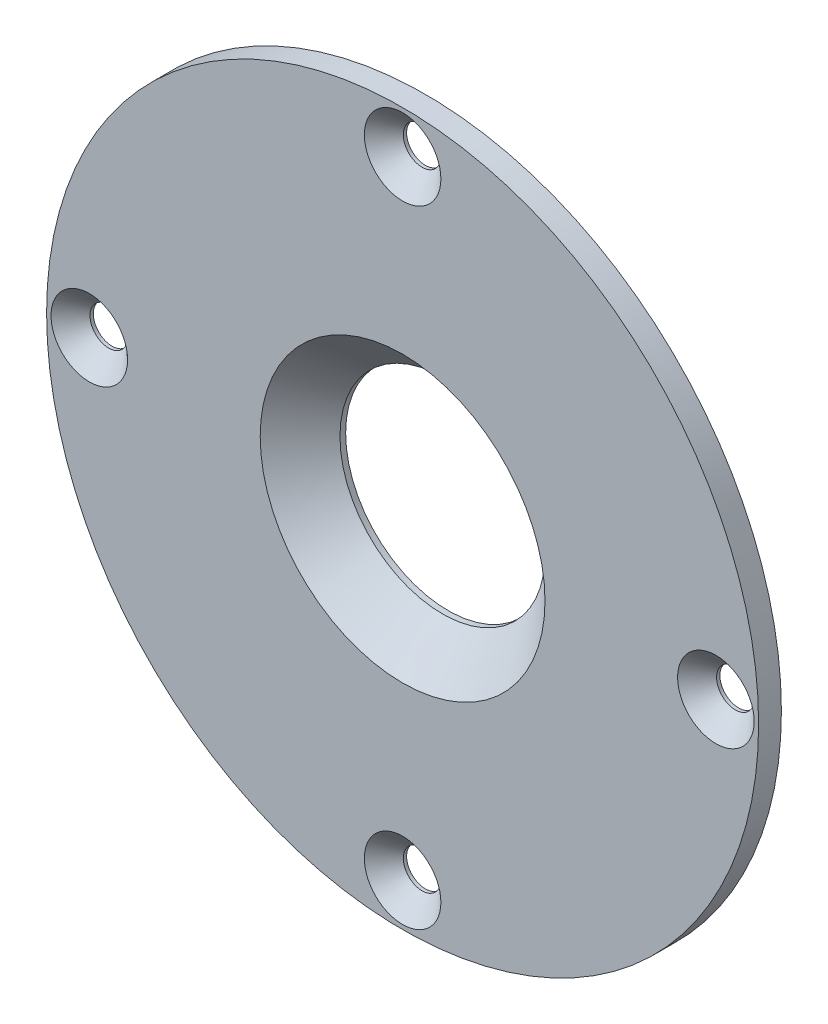
ISO-10303-21;
HEADER;
FILE_DESCRIPTION(('STEP AP214'),'2;1');
FILE_NAME('part.step','',(''),(''),'','','');
FILE_SCHEMA(('AUTOMOTIVE_DESIGN { 1 0 10303 214 1 1 1 1 }'));
ENDSEC;
DATA;
#1=APPLICATION_CONTEXT('core data for automotive mechanical design processes');
#2=APPLICATION_PROTOCOL_DEFINITION('international standard','automotive_design',2000,#1);
#3=PRODUCT_CONTEXT('',#1,'mechanical');
#4=PRODUCT('Part','Part','',(#3));
#5=PRODUCT_RELATED_PRODUCT_CATEGORY('part','',(#4));
#6=PRODUCT_DEFINITION_FORMATION('','',#4);
#7=PRODUCT_DEFINITION_CONTEXT('part definition',#1,'design');
#8=PRODUCT_DEFINITION('design','',#6,#7);
#9=PRODUCT_DEFINITION_SHAPE('','',#8);
#10=(LENGTH_UNIT() NAMED_UNIT(*) SI_UNIT(.MILLI.,.METRE.));
#11=(NAMED_UNIT(*) PLANE_ANGLE_UNIT() SI_UNIT($,.RADIAN.));
#12=(NAMED_UNIT(*) SI_UNIT($,.STERADIAN.) SOLID_ANGLE_UNIT());
#13=UNCERTAINTY_MEASURE_WITH_UNIT(LENGTH_MEASURE(1.E-05),#10,'distance_accuracy_value','');
#14=(GEOMETRIC_REPRESENTATION_CONTEXT(3) GLOBAL_UNCERTAINTY_ASSIGNED_CONTEXT((#13)) GLOBAL_UNIT_ASSIGNED_CONTEXT((#10,
#11,#12)) REPRESENTATION_CONTEXT('',''));
#15=CARTESIAN_POINT('',(0.,0.,0.));
#16=DIRECTION('',(0.,0.,1.));
#17=DIRECTION('',(1.,0.,0.));
#18=AXIS2_PLACEMENT_3D('',#15,#16,#17);
#19=CARTESIAN_POINT('',(0.,0.,0.));
#20=DIRECTION('',(0.,0.,1.));
#21=DIRECTION('',(1.,0.,0.));
#22=AXIS2_PLACEMENT_3D('',#19,#20,#21);
#23=PLANE('',#22);
#24=CARTESIAN_POINT('',(0.,0.,0.));
#25=DIRECTION('',(0.,0.,-1.));
#26=DIRECTION('',(-1.,0.,0.));
#27=AXIS2_PLACEMENT_3D('',#24,#25,#26);
#28=CIRCLE('',#27,45.);
#29=CARTESIAN_POINT('',(-45.,0.,0.));
#30=VERTEX_POINT('',#29);
#31=EDGE_CURVE('E10',#30,#30,#28,.T.);
#32=ORIENTED_EDGE('',*,*,#31,.T.);
#33=EDGE_LOOP('',(#32));
#34=FACE_BOUND('',#33,.T.);
#35=CARTESIAN_POINT('',(0.,0.,0.));
#36=DIRECTION('',(0.,0.,-1.));
#37=DIRECTION('',(-1.,0.,0.));
#38=AXIS2_PLACEMENT_3D('',#35,#36,#37);
#39=CIRCLE('',#38,18.);
#40=CARTESIAN_POINT('',(-18.,0.,0.));
#41=VERTEX_POINT('',#40);
#42=EDGE_CURVE('E85',#41,#41,#39,.T.);
#43=ORIENTED_EDGE('',*,*,#42,.F.);
#44=EDGE_LOOP('',(#43));
#45=FACE_BOUND('',#44,.T.);
#46=ADVANCED_FACE('F32',(#34,#45),#23,.F.);
#47=CARTESIAN_POINT('',(62.5,0.,8.00000000000001));
#48=DIRECTION('',(0.,0.,-1.));
#49=DIRECTION('',(-1.,0.,0.));
#50=AXIS2_PLACEMENT_3D('',#47,#48,#49);
#51=PLANE('',#50);
#52=CARTESIAN_POINT('',(-55.,0.,8.00000000000001));
#53=DIRECTION('',(0.,0.,1.));
#54=DIRECTION('',(1.,0.,0.));
#55=AXIS2_PLACEMENT_3D('',#52,#53,#54);
#56=CIRCLE('',#55,6.72);
#57=CARTESIAN_POINT('',(-48.28,0.,8.00000000000001));
#58=VERTEX_POINT('',#57);
#59=EDGE_CURVE('E244',#58,#58,#56,.T.);
#60=ORIENTED_EDGE('',*,*,#59,.F.);
#61=EDGE_LOOP('',(#60));
#62=FACE_BOUND('',#61,.T.);
#63=CARTESIAN_POINT('',(0.,55.,8.00000000000001));
#64=DIRECTION('',(0.,0.,1.));
#65=DIRECTION('',(1.,0.,0.));
#66=AXIS2_PLACEMENT_3D('',#63,#64,#65);
#67=CIRCLE('',#66,6.72);
#68=CARTESIAN_POINT('',(6.72,55.,8.00000000000001));
#69=VERTEX_POINT('',#68);
#70=EDGE_CURVE('E66',#69,#69,#67,.T.);
#71=ORIENTED_EDGE('',*,*,#70,.F.);
#72=EDGE_LOOP('',(#71));
#73=FACE_BOUND('',#72,.T.);
#74=CARTESIAN_POINT('',(55.,0.,8.00000000000001));
#75=DIRECTION('',(0.,0.,1.));
#76=DIRECTION('',(1.,0.,0.));
#77=AXIS2_PLACEMENT_3D('',#74,#75,#76);
#78=CIRCLE('',#77,6.72);
#79=CARTESIAN_POINT('',(61.72,0.,8.00000000000001));
#80=VERTEX_POINT('',#79);
#81=EDGE_CURVE('E59',#80,#80,#78,.T.);
#82=ORIENTED_EDGE('',*,*,#81,.F.);
#83=EDGE_LOOP('',(#82));
#84=FACE_BOUND('',#83,.T.);
#85=CARTESIAN_POINT('',(0.,-55.,8.00000000000001));
#86=DIRECTION('',(0.,0.,1.));
#87=DIRECTION('',(1.,0.,0.));
#88=AXIS2_PLACEMENT_3D('',#85,#86,#87);
#89=CIRCLE('',#88,6.72);
#90=CARTESIAN_POINT('',(6.72,-55.,8.00000000000001));
#91=VERTEX_POINT('',#90);
#92=EDGE_CURVE('E55',#91,#91,#89,.T.);
#93=ORIENTED_EDGE('',*,*,#92,.F.);
#94=EDGE_LOOP('',(#93));
#95=FACE_BOUND('',#94,.T.);
#96=CARTESIAN_POINT('',(0.,0.,8.00000000000001));
#97=DIRECTION('',(0.,0.,-1.));
#98=DIRECTION('',(-1.,0.,0.));
#99=AXIS2_PLACEMENT_3D('',#96,#97,#98);
#100=CIRCLE('',#99,62.5);
#101=CARTESIAN_POINT('',(-62.5,0.,8.00000000000001));
#102=VERTEX_POINT('',#101);
#103=EDGE_CURVE('E88',#102,#102,#100,.T.);
#104=ORIENTED_EDGE('',*,*,#103,.F.);
#105=EDGE_LOOP('',(#104));
#106=FACE_BOUND('',#105,.T.);
#107=CARTESIAN_POINT('',(0.,0.,8.00000000000001));
#108=DIRECTION('',(0.,0.,-1.));
#109=DIRECTION('',(-1.,0.,0.));
#110=AXIS2_PLACEMENT_3D('',#107,#108,#109);
#111=CIRCLE('',#110,25.);
#112=CARTESIAN_POINT('',(-25.,0.,8.00000000000001));
#113=VERTEX_POINT('',#112);
#114=EDGE_CURVE('E51',#113,#113,#111,.T.);
#115=ORIENTED_EDGE('',*,*,#114,.T.);
#116=EDGE_LOOP('',(#115));
#117=FACE_BOUND('',#116,.T.);
#118=ADVANCED_FACE('F102',(#62,#73,#84,#95,#106,#117),#51,.F.);
#119=CARTESIAN_POINT('',(0.,0.,8.00000000000001));
#120=DIRECTION('',(0.,0.,-1.));
#121=DIRECTION('',(-1.,0.,0.));
#122=AXIS2_PLACEMENT_3D('',#119,#120,#121);
#123=CYLINDRICAL_SURFACE('',#122,45.);
#124=ORIENTED_EDGE('',*,*,#31,.F.);
#125=EDGE_LOOP('',(#124));
#126=FACE_BOUND('',#125,.T.);
#127=CARTESIAN_POINT('',(0.,0.,4.));
#128=DIRECTION('',(0.,0.,-1.));
#129=DIRECTION('',(-1.,0.,0.));
#130=AXIS2_PLACEMENT_3D('',#127,#128,#129);
#131=CIRCLE('',#130,45.);
#132=CARTESIAN_POINT('',(-45.,0.,4.));
#133=VERTEX_POINT('',#132);
#134=EDGE_CURVE('E39',#133,#133,#131,.T.);
#135=ORIENTED_EDGE('',*,*,#134,.T.);
#136=EDGE_LOOP('',(#135));
#137=FACE_BOUND('',#136,.T.);
#138=ADVANCED_FACE('F105',(#126,#137),#123,.T.);
#139=CARTESIAN_POINT('',(45.,0.,4.));
#140=DIRECTION('',(0.,0.,1.));
#141=DIRECTION('',(1.,0.,0.));
#142=AXIS2_PLACEMENT_3D('',#139,#140,#141);
#143=PLANE('',#142);
#144=CARTESIAN_POINT('',(-55.,0.,4.));
#145=DIRECTION('',(0.,0.,1.));
#146=DIRECTION('',(1.,0.,0.));
#147=AXIS2_PLACEMENT_3D('',#144,#145,#146);
#148=CIRCLE('',#147,3.29999999999999);
#149=CARTESIAN_POINT('',(-51.7,0.,4.));
#150=VERTEX_POINT('',#149);
#151=EDGE_CURVE('E35',#150,#150,#148,.T.);
#152=ORIENTED_EDGE('',*,*,#151,.T.);
#153=EDGE_LOOP('',(#152));
#154=FACE_BOUND('',#153,.T.);
#155=CARTESIAN_POINT('',(0.,55.,4.));
#156=DIRECTION('',(0.,0.,1.));
#157=DIRECTION('',(1.,0.,0.));
#158=AXIS2_PLACEMENT_3D('',#155,#156,#157);
#159=CIRCLE('',#158,3.29999999999999);
#160=CARTESIAN_POINT('',(3.29999999999999,55.,4.));
#161=VERTEX_POINT('',#160);
#162=EDGE_CURVE('E57',#161,#161,#159,.T.);
#163=ORIENTED_EDGE('',*,*,#162,.T.);
#164=EDGE_LOOP('',(#163));
#165=FACE_BOUND('',#164,.T.);
#166=CARTESIAN_POINT('',(55.,0.,4.));
#167=DIRECTION('',(0.,0.,1.));
#168=DIRECTION('',(1.,0.,0.));
#169=AXIS2_PLACEMENT_3D('',#166,#167,#168);
#170=CIRCLE('',#169,3.29999999999999);
#171=CARTESIAN_POINT('',(58.3,0.,4.));
#172=VERTEX_POINT('',#171);
#173=EDGE_CURVE('E53',#172,#172,#170,.T.);
#174=ORIENTED_EDGE('',*,*,#173,.T.);
#175=EDGE_LOOP('',(#174));
#176=FACE_BOUND('',#175,.T.);
#177=CARTESIAN_POINT('',(0.,-55.,4.));
#178=DIRECTION('',(0.,0.,1.));
#179=DIRECTION('',(1.,0.,0.));
#180=AXIS2_PLACEMENT_3D('',#177,#178,#179);
#181=CIRCLE('',#180,3.29999999999999);
#182=CARTESIAN_POINT('',(3.29999999999999,-55.,4.));
#183=VERTEX_POINT('',#182);
#184=EDGE_CURVE('E48',#183,#183,#181,.T.);
#185=ORIENTED_EDGE('',*,*,#184,.T.);
#186=EDGE_LOOP('',(#185));
#187=FACE_BOUND('',#186,.T.);
#188=ORIENTED_EDGE('',*,*,#134,.F.);
#189=EDGE_LOOP('',(#188));
#190=FACE_BOUND('',#189,.T.);
#191=CARTESIAN_POINT('',(0.,0.,4.));
#192=DIRECTION('',(0.,0.,-1.));
#193=DIRECTION('',(-1.,0.,0.));
#194=AXIS2_PLACEMENT_3D('',#191,#192,#193);
#195=CIRCLE('',#194,62.5);
#196=CARTESIAN_POINT('',(-62.5,0.,4.));
#197=VERTEX_POINT('',#196);
#198=EDGE_CURVE('E44',#197,#197,#195,.T.);
#199=ORIENTED_EDGE('',*,*,#198,.T.);
#200=EDGE_LOOP('',(#199));
#201=FACE_BOUND('',#200,.T.);
#202=ADVANCED_FACE('F93',(#154,#165,#176,#187,#190,#201),#143,.F.);
#203=CARTESIAN_POINT('',(0.,0.,8.00000000000001));
#204=DIRECTION('',(0.,0.,-1.));
#205=DIRECTION('',(-1.,0.,0.));
#206=AXIS2_PLACEMENT_3D('',#203,#204,#205);
#207=CYLINDRICAL_SURFACE('',#206,62.5);
#208=ORIENTED_EDGE('',*,*,#198,.F.);
#209=EDGE_LOOP('',(#208));
#210=FACE_BOUND('',#209,.T.);
#211=ORIENTED_EDGE('',*,*,#103,.T.);
#212=EDGE_LOOP('',(#211));
#213=FACE_BOUND('',#212,.T.);
#214=ADVANCED_FACE('F95',(#210,#213),#207,.T.);
#215=CARTESIAN_POINT('',(0.,0.,8.00000000000001));
#216=DIRECTION('',(0.,0.,-1.));
#217=DIRECTION('',(-1.,0.,0.));
#218=AXIS2_PLACEMENT_3D('',#215,#216,#217);
#219=CYLINDRICAL_SURFACE('',#218,18.);
#220=ORIENTED_EDGE('',*,*,#42,.T.);
#221=EDGE_LOOP('',(#220));
#222=FACE_BOUND('',#221,.T.);
#223=CARTESIAN_POINT('',(0.,0.,1.));
#224=DIRECTION('',(0.,0.,-1.));
#225=DIRECTION('',(-1.,0.,0.));
#226=AXIS2_PLACEMENT_3D('',#223,#224,#225);
#227=CIRCLE('',#226,18.);
#228=CARTESIAN_POINT('',(-18.,0.,1.));
#229=VERTEX_POINT('',#228);
#230=EDGE_CURVE('E82',#229,#229,#227,.T.);
#231=ORIENTED_EDGE('',*,*,#230,.F.);
#232=EDGE_LOOP('',(#231));
#233=FACE_BOUND('',#232,.T.);
#234=ADVANCED_FACE('F98',(#222,#233),#219,.F.);
#235=CARTESIAN_POINT('',(0.,0.,8.00000000000001));
#236=DIRECTION('',(0.,0.,1.));
#237=DIRECTION('',(1.,0.,0.));
#238=AXIS2_PLACEMENT_3D('',#235,#236,#237);
#239=CONICAL_SURFACE('',#238,25.,0.785398163397448);
#240=ORIENTED_EDGE('',*,*,#230,.T.);
#241=EDGE_LOOP('',(#240));
#242=FACE_BOUND('',#241,.T.);
#243=ORIENTED_EDGE('',*,*,#114,.F.);
#244=EDGE_LOOP('',(#243));
#245=FACE_BOUND('',#244,.T.);
#246=ADVANCED_FACE('F110',(#242,#245),#239,.F.);
#247=CARTESIAN_POINT('',(0.,-55.,8.00000000000001));
#248=DIRECTION('',(0.,0.,1.));
#249=DIRECTION('',(1.,0.,0.));
#250=AXIS2_PLACEMENT_3D('',#247,#248,#249);
#251=CYLINDRICAL_SURFACE('',#250,3.29999999999999);
#252=CARTESIAN_POINT('',(0.,-55.,4.57999999999997));
#253=DIRECTION('',(0.,0.,1.));
#254=DIRECTION('',(1.,0.,0.));
#255=AXIS2_PLACEMENT_3D('',#252,#253,#254);
#256=CIRCLE('',#255,3.3);
#257=CARTESIAN_POINT('',(3.3,-55.,4.57999999999997));
#258=VERTEX_POINT('',#257);
#259=EDGE_CURVE('E52',#258,#258,#256,.T.);
#260=ORIENTED_EDGE('',*,*,#259,.T.);
#261=EDGE_LOOP('',(#260));
#262=FACE_BOUND('',#261,.T.);
#263=ORIENTED_EDGE('',*,*,#184,.F.);
#264=EDGE_LOOP('',(#263));
#265=FACE_BOUND('',#264,.T.);
#266=ADVANCED_FACE('F112',(#262,#265),#251,.F.);
#267=CARTESIAN_POINT('',(0.,-55.,8.00000000000001));
#268=DIRECTION('',(0.,0.,1.));
#269=DIRECTION('',(1.,0.,0.));
#270=AXIS2_PLACEMENT_3D('',#267,#268,#269);
#271=CONICAL_SURFACE('',#270,6.72,0.785398163397448);
#272=ORIENTED_EDGE('',*,*,#259,.F.);
#273=EDGE_LOOP('',(#272));
#274=FACE_BOUND('',#273,.T.);
#275=ORIENTED_EDGE('',*,*,#92,.T.);
#276=EDGE_LOOP('',(#275));
#277=FACE_BOUND('',#276,.T.);
#278=ADVANCED_FACE('F119',(#274,#277),#271,.F.);
#279=CARTESIAN_POINT('',(55.,0.,8.00000000000001));
#280=DIRECTION('',(0.,0.,1.));
#281=DIRECTION('',(1.,0.,0.));
#282=AXIS2_PLACEMENT_3D('',#279,#280,#281);
#283=CYLINDRICAL_SURFACE('',#282,3.29999999999999);
#284=CARTESIAN_POINT('',(55.,0.,4.57999999999997));
#285=DIRECTION('',(0.,0.,1.));
#286=DIRECTION('',(1.,0.,0.));
#287=AXIS2_PLACEMENT_3D('',#284,#285,#286);
#288=CIRCLE('',#287,3.3);
#289=CARTESIAN_POINT('',(58.3,0.,4.57999999999997));
#290=VERTEX_POINT('',#289);
#291=EDGE_CURVE('E56',#290,#290,#288,.T.);
#292=ORIENTED_EDGE('',*,*,#291,.T.);
#293=EDGE_LOOP('',(#292));
#294=FACE_BOUND('',#293,.T.);
#295=ORIENTED_EDGE('',*,*,#173,.F.);
#296=EDGE_LOOP('',(#295));
#297=FACE_BOUND('',#296,.T.);
#298=ADVANCED_FACE('F175',(#294,#297),#283,.F.);
#299=CARTESIAN_POINT('',(55.,0.,8.00000000000001));
#300=DIRECTION('',(0.,0.,1.));
#301=DIRECTION('',(1.,0.,0.));
#302=AXIS2_PLACEMENT_3D('',#299,#300,#301);
#303=CONICAL_SURFACE('',#302,6.72,0.785398163397447);
#304=ORIENTED_EDGE('',*,*,#291,.F.);
#305=EDGE_LOOP('',(#304));
#306=FACE_BOUND('',#305,.T.);
#307=ORIENTED_EDGE('',*,*,#81,.T.);
#308=EDGE_LOOP('',(#307));
#309=FACE_BOUND('',#308,.T.);
#310=ADVANCED_FACE('F185',(#306,#309),#303,.F.);
#311=CARTESIAN_POINT('',(0.,55.,8.00000000000001));
#312=DIRECTION('',(0.,0.,1.));
#313=DIRECTION('',(1.,0.,0.));
#314=AXIS2_PLACEMENT_3D('',#311,#312,#313);
#315=CYLINDRICAL_SURFACE('',#314,3.29999999999999);
#316=CARTESIAN_POINT('',(0.,55.,4.57999999999997));
#317=DIRECTION('',(0.,0.,1.));
#318=DIRECTION('',(1.,0.,0.));
#319=AXIS2_PLACEMENT_3D('',#316,#317,#318);
#320=CIRCLE('',#319,3.3);
#321=CARTESIAN_POINT('',(3.3,55.,4.57999999999997));
#322=VERTEX_POINT('',#321);
#323=EDGE_CURVE('E60',#322,#322,#320,.T.);
#324=ORIENTED_EDGE('',*,*,#323,.T.);
#325=EDGE_LOOP('',(#324));
#326=FACE_BOUND('',#325,.T.);
#327=ORIENTED_EDGE('',*,*,#162,.F.);
#328=EDGE_LOOP('',(#327));
#329=FACE_BOUND('',#328,.T.);
#330=ADVANCED_FACE('F195',(#326,#329),#315,.F.);
#331=CARTESIAN_POINT('',(0.,55.,8.00000000000001));
#332=DIRECTION('',(0.,0.,1.));
#333=DIRECTION('',(1.,0.,0.));
#334=AXIS2_PLACEMENT_3D('',#331,#332,#333);
#335=CONICAL_SURFACE('',#334,6.72,0.785398163397448);
#336=ORIENTED_EDGE('',*,*,#323,.F.);
#337=EDGE_LOOP('',(#336));
#338=FACE_BOUND('',#337,.T.);
#339=ORIENTED_EDGE('',*,*,#70,.T.);
#340=EDGE_LOOP('',(#339));
#341=FACE_BOUND('',#340,.T.);
#342=ADVANCED_FACE('F205',(#338,#341),#335,.F.);
#343=CARTESIAN_POINT('',(-55.,0.,8.00000000000001));
#344=DIRECTION('',(0.,0.,1.));
#345=DIRECTION('',(1.,0.,0.));
#346=AXIS2_PLACEMENT_3D('',#343,#344,#345);
#347=CYLINDRICAL_SURFACE('',#346,3.29999999999999);
#348=CARTESIAN_POINT('',(-55.,0.,4.57999999999997));
#349=DIRECTION('',(0.,0.,1.));
#350=DIRECTION('',(1.,0.,0.));
#351=AXIS2_PLACEMENT_3D('',#348,#349,#350);
#352=CIRCLE('',#351,3.3);
#353=CARTESIAN_POINT('',(-51.7,0.,4.57999999999997));
#354=VERTEX_POINT('',#353);
#355=EDGE_CURVE('E241',#354,#354,#352,.T.);
#356=ORIENTED_EDGE('',*,*,#355,.T.);
#357=EDGE_LOOP('',(#356));
#358=FACE_BOUND('',#357,.T.);
#359=ORIENTED_EDGE('',*,*,#151,.F.);
#360=EDGE_LOOP('',(#359));
#361=FACE_BOUND('',#360,.T.);
#362=ADVANCED_FACE('F214',(#358,#361),#347,.F.);
#363=CARTESIAN_POINT('',(-55.,0.,8.00000000000001));
#364=DIRECTION('',(0.,0.,1.));
#365=DIRECTION('',(1.,0.,0.));
#366=AXIS2_PLACEMENT_3D('',#363,#364,#365);
#367=CONICAL_SURFACE('',#366,6.72,0.785398163397447);
#368=ORIENTED_EDGE('',*,*,#355,.F.);
#369=EDGE_LOOP('',(#368));
#370=FACE_BOUND('',#369,.T.);
#371=ORIENTED_EDGE('',*,*,#59,.T.);
#372=EDGE_LOOP('',(#371));
#373=FACE_BOUND('',#372,.T.);
#374=ADVANCED_FACE('F224',(#370,#373),#367,.F.);
#375=CLOSED_SHELL('',(#46,#118,#138,#202,#214,#234,#246,#266,#278,#298,#310,#330,#342,#362,#374));
#376=MANIFOLD_SOLID_BREP('B2',#375);
#377=ADVANCED_BREP_SHAPE_REPRESENTATION('',(#18,#376),#14);
#378=SHAPE_DEFINITION_REPRESENTATION(#9,#377);
ENDSEC;
END-ISO-10303-21;
